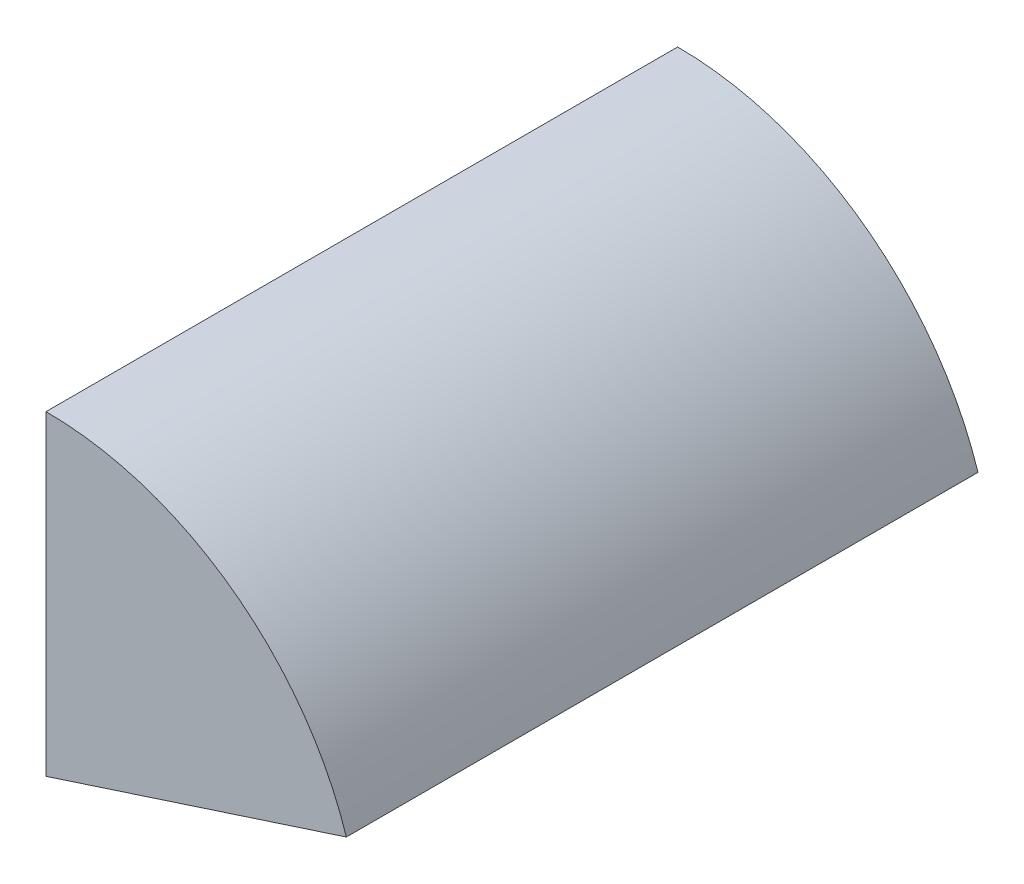
ISO-10303-21;
HEADER;
FILE_DESCRIPTION(('STEP AP214'),'2;1');
FILE_NAME('part.step','',(''),(''),'','','');
FILE_SCHEMA(('AUTOMOTIVE_DESIGN { 1 0 10303 214 1 1 1 1 }'));
ENDSEC;
DATA;
#1=APPLICATION_CONTEXT('core data for automotive mechanical design processes');
#2=APPLICATION_PROTOCOL_DEFINITION('international standard','automotive_design',2000,#1);
#3=PRODUCT_CONTEXT('',#1,'mechanical');
#4=PRODUCT('Part','Part','',(#3));
#5=PRODUCT_RELATED_PRODUCT_CATEGORY('part','',(#4));
#6=PRODUCT_DEFINITION_FORMATION('','',#4);
#7=PRODUCT_DEFINITION_CONTEXT('part definition',#1,'design');
#8=PRODUCT_DEFINITION('design','',#6,#7);
#9=PRODUCT_DEFINITION_SHAPE('','',#8);
#10=(LENGTH_UNIT() NAMED_UNIT(*) SI_UNIT(.MILLI.,.METRE.));
#11=(NAMED_UNIT(*) PLANE_ANGLE_UNIT() SI_UNIT($,.RADIAN.));
#12=(NAMED_UNIT(*) SI_UNIT($,.STERADIAN.) SOLID_ANGLE_UNIT());
#13=UNCERTAINTY_MEASURE_WITH_UNIT(LENGTH_MEASURE(1.E-05),#10,'distance_accuracy_value','');
#14=(GEOMETRIC_REPRESENTATION_CONTEXT(3) GLOBAL_UNCERTAINTY_ASSIGNED_CONTEXT((#13)) GLOBAL_UNIT_ASSIGNED_CONTEXT((#10,
#11,#12)) REPRESENTATION_CONTEXT('',''));
#15=CARTESIAN_POINT('',(0.,0.,0.));
#16=DIRECTION('',(0.,0.,1.));
#17=DIRECTION('',(1.,0.,0.));
#18=AXIS2_PLACEMENT_3D('',#15,#16,#17);
#19=CARTESIAN_POINT('',(0.,0.,50.));
#20=DIRECTION('',(-0.309016994374952,0.951056516295152,0.));
#21=DIRECTION('',(-0.951056516295152,-0.309016994374952,0.));
#22=AXIS2_PLACEMENT_3D('',#19,#20,#21);
#23=PLANE('',#22);
#24=DIRECTION('',(0.951056516295152,0.309016994374952,0.));
#25=VECTOR('',#24,1.);
#26=CARTESIAN_POINT('',(0.,0.,0.));
#27=LINE('',#26,#25);
#28=CARTESIAN_POINT('',(0.,0.,0.));
#29=VERTEX_POINT('',#28);
#30=CARTESIAN_POINT('',(23.7764129073788,7.7254248593738,0.));
#31=VERTEX_POINT('',#30);
#32=EDGE_CURVE('E80',#29,#31,#27,.T.);
#33=ORIENTED_EDGE('',*,*,#32,.T.);
#34=DIRECTION('',(0.,0.,-1.));
#35=VECTOR('',#34,1.);
#36=CARTESIAN_POINT('',(23.7764129073788,7.7254248593738,50.));
#37=LINE('',#36,#35);
#38=CARTESIAN_POINT('',(23.7764129073788,7.7254248593738,50.));
#39=VERTEX_POINT('',#38);
#40=EDGE_CURVE('E11',#39,#31,#37,.T.);
#41=ORIENTED_EDGE('',*,*,#40,.F.);
#42=DIRECTION('',(0.951056516295152,0.309016994374952,0.));
#43=VECTOR('',#42,1.);
#44=CARTESIAN_POINT('',(0.,0.,50.));
#45=LINE('',#44,#43);
#46=CARTESIAN_POINT('',(0.,0.,50.));
#47=VERTEX_POINT('',#46);
#48=EDGE_CURVE('E73',#47,#39,#45,.T.);
#49=ORIENTED_EDGE('',*,*,#48,.F.);
#50=DIRECTION('',(0.,0.,-1.));
#51=VECTOR('',#50,1.);
#52=CARTESIAN_POINT('',(0.,0.,50.));
#53=LINE('',#52,#51);
#54=EDGE_CURVE('E81',#47,#29,#53,.T.);
#55=ORIENTED_EDGE('',*,*,#54,.T.);
#56=EDGE_LOOP('',(#33,#41,#49,#55));
#57=FACE_BOUND('',#56,.T.);
#58=ADVANCED_FACE('F33',(#57),#23,.F.);
#59=CARTESIAN_POINT('',(0.,0.,50.));
#60=DIRECTION('',(0.,0.,-1.));
#61=DIRECTION('',(-1.,0.,0.));
#62=AXIS2_PLACEMENT_3D('',#59,#60,#61);
#63=CYLINDRICAL_SURFACE('',#62,25.);
#64=CARTESIAN_POINT('',(0.,0.,0.));
#65=DIRECTION('',(0.,0.,1.));
#66=DIRECTION('',(1.,0.,0.));
#67=AXIS2_PLACEMENT_3D('',#64,#65,#66);
#68=CIRCLE('',#67,25.);
#69=CARTESIAN_POINT('',(0.,25.,0.));
#70=VERTEX_POINT('',#69);
#71=EDGE_CURVE('E61',#31,#70,#68,.T.);
#72=ORIENTED_EDGE('',*,*,#71,.T.);
#73=DIRECTION('',(0.,0.,-1.));
#74=VECTOR('',#73,1.);
#75=CARTESIAN_POINT('',(0.,25.,50.));
#76=LINE('',#75,#74);
#77=CARTESIAN_POINT('',(0.,25.,50.));
#78=VERTEX_POINT('',#77);
#79=EDGE_CURVE('E41',#78,#70,#76,.T.);
#80=ORIENTED_EDGE('',*,*,#79,.F.);
#81=CARTESIAN_POINT('',(0.,0.,50.));
#82=DIRECTION('',(0.,0.,1.));
#83=DIRECTION('',(1.,0.,0.));
#84=AXIS2_PLACEMENT_3D('',#81,#82,#83);
#85=CIRCLE('',#84,25.);
#86=EDGE_CURVE('E69',#39,#78,#85,.T.);
#87=ORIENTED_EDGE('',*,*,#86,.F.);
#88=ORIENTED_EDGE('',*,*,#40,.T.);
#89=EDGE_LOOP('',(#72,#80,#87,#88));
#90=FACE_BOUND('',#89,.T.);
#91=ADVANCED_FACE('F70',(#90),#63,.T.);
#92=CARTESIAN_POINT('',(0.,25.,50.));
#93=DIRECTION('',(1.,0.,0.));
#94=DIRECTION('',(0.,0.,-1.));
#95=AXIS2_PLACEMENT_3D('',#92,#93,#94);
#96=PLANE('',#95);
#97=DIRECTION('',(0.,-1.,0.));
#98=VECTOR('',#97,1.);
#99=CARTESIAN_POINT('',(0.,25.,0.));
#100=LINE('',#99,#98);
#101=EDGE_CURVE('E66',#70,#29,#100,.T.);
#102=ORIENTED_EDGE('',*,*,#101,.T.);
#103=ORIENTED_EDGE('',*,*,#54,.F.);
#104=DIRECTION('',(0.,-1.,0.));
#105=VECTOR('',#104,1.);
#106=CARTESIAN_POINT('',(0.,25.,50.));
#107=LINE('',#106,#105);
#108=EDGE_CURVE('E49',#78,#47,#107,.T.);
#109=ORIENTED_EDGE('',*,*,#108,.F.);
#110=ORIENTED_EDGE('',*,*,#79,.T.);
#111=EDGE_LOOP('',(#102,#103,#109,#110));
#112=FACE_BOUND('',#111,.T.);
#113=ADVANCED_FACE('F92',(#112),#96,.F.);
#114=CARTESIAN_POINT('',(0.,0.,50.));
#115=DIRECTION('',(0.,0.,1.));
#116=DIRECTION('',(1.,0.,0.));
#117=AXIS2_PLACEMENT_3D('',#114,#115,#116);
#118=PLANE('',#117);
#119=ORIENTED_EDGE('',*,*,#48,.T.);
#120=ORIENTED_EDGE('',*,*,#86,.T.);
#121=ORIENTED_EDGE('',*,*,#108,.T.);
#122=EDGE_LOOP('',(#119,#120,#121));
#123=FACE_BOUND('',#122,.T.);
#124=ADVANCED_FACE('F76',(#123),#118,.T.);
#125=CARTESIAN_POINT('',(0.,0.,0.));
#126=DIRECTION('',(0.,0.,1.));
#127=DIRECTION('',(1.,0.,0.));
#128=AXIS2_PLACEMENT_3D('',#125,#126,#127);
#129=PLANE('',#128);
#130=CARTESIAN_POINT('',(8.73083477540846,12.2907765755358,0.));
#131=DIRECTION('',(0.,0.,-1.));
#132=DIRECTION('',(-1.,0.,0.));
#133=AXIS2_PLACEMENT_3D('',#130,#131,#132);
#134=CIRCLE('',#133,5.);
#135=CARTESIAN_POINT('',(3.73083477540846,12.2907765755358,0.));
#136=VERTEX_POINT('',#135);
#137=EDGE_CURVE('E87',#136,#136,#134,.T.);
#138=ORIENTED_EDGE('',*,*,#137,.F.);
#139=EDGE_LOOP('',(#138));
#140=FACE_BOUND('',#139,.T.);
#141=ORIENTED_EDGE('',*,*,#32,.F.);
#142=ORIENTED_EDGE('',*,*,#101,.F.);
#143=ORIENTED_EDGE('',*,*,#71,.F.);
#144=EDGE_LOOP('',(#141,#142,#143));
#145=FACE_BOUND('',#144,.T.);
#146=ADVANCED_FACE('F93',(#140,#145),#129,.F.);
#147=CARTESIAN_POINT('',(8.73083477540846,12.2907765755358,10.));
#148=DIRECTION('',(0.,0.,-1.));
#149=DIRECTION('',(-1.,0.,0.));
#150=AXIS2_PLACEMENT_3D('',#147,#148,#149);
#151=CYLINDRICAL_SURFACE('',#150,5.);
#152=CARTESIAN_POINT('',(8.73083477540846,12.2907765755358,10.));
#153=DIRECTION('',(0.,0.,-1.));
#154=DIRECTION('',(-1.,0.,0.));
#155=AXIS2_PLACEMENT_3D('',#152,#153,#154);
#156=CIRCLE('',#155,5.);
#157=CARTESIAN_POINT('',(3.73083477540846,12.2907765755358,10.));
#158=VERTEX_POINT('',#157);
#159=EDGE_CURVE('E83',#158,#158,#156,.T.);
#160=ORIENTED_EDGE('',*,*,#159,.F.);
#161=EDGE_LOOP('',(#160));
#162=FACE_BOUND('',#161,.T.);
#163=ORIENTED_EDGE('',*,*,#137,.T.);
#164=EDGE_LOOP('',(#163));
#165=FACE_BOUND('',#164,.T.);
#166=ADVANCED_FACE('F95',(#162,#165),#151,.F.);
#167=CARTESIAN_POINT('',(8.73083477540846,12.2907765755358,10.));
#168=DIRECTION('',(0.,0.,-1.));
#169=DIRECTION('',(-1.,0.,0.));
#170=AXIS2_PLACEMENT_3D('',#167,#168,#169);
#171=PLANE('',#170);
#172=ORIENTED_EDGE('',*,*,#159,.T.);
#173=EDGE_LOOP('',(#172));
#174=FACE_BOUND('',#173,.T.);
#175=ADVANCED_FACE('F102',(#174),#171,.T.);
#176=CLOSED_SHELL('',(#58,#91,#113,#124,#146,#166,#175));
#177=MANIFOLD_SOLID_BREP('B2',#176);
#178=ADVANCED_BREP_SHAPE_REPRESENTATION('',(#18,#177),#14);
#179=SHAPE_DEFINITION_REPRESENTATION(#9,#178);
ENDSEC;
END-ISO-10303-21;
